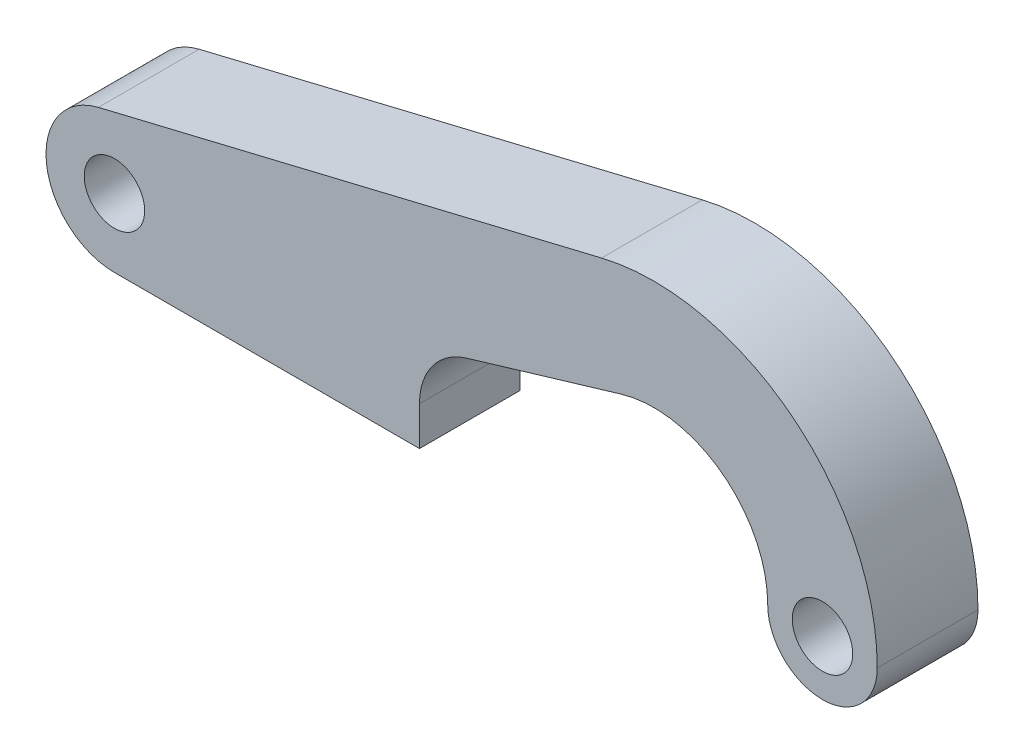
ISO-10303-21;
HEADER;
FILE_DESCRIPTION(('STEP AP214'),'2;1');
FILE_NAME('part.step','',(''),(''),'','','');
FILE_SCHEMA(('AUTOMOTIVE_DESIGN { 1 0 10303 214 1 1 1 1 }'));
ENDSEC;
DATA;
#1=APPLICATION_CONTEXT('core data for automotive mechanical design processes');
#2=APPLICATION_PROTOCOL_DEFINITION('international standard','automotive_design',2000,#1);
#3=PRODUCT_CONTEXT('',#1,'mechanical');
#4=PRODUCT('Part','Part','',(#3));
#5=PRODUCT_RELATED_PRODUCT_CATEGORY('part','',(#4));
#6=PRODUCT_DEFINITION_FORMATION('','',#4);
#7=PRODUCT_DEFINITION_CONTEXT('part definition',#1,'design');
#8=PRODUCT_DEFINITION('design','',#6,#7);
#9=PRODUCT_DEFINITION_SHAPE('','',#8);
#10=(LENGTH_UNIT() NAMED_UNIT(*) SI_UNIT(.MILLI.,.METRE.));
#11=(NAMED_UNIT(*) PLANE_ANGLE_UNIT() SI_UNIT($,.RADIAN.));
#12=(NAMED_UNIT(*) SI_UNIT($,.STERADIAN.) SOLID_ANGLE_UNIT());
#13=UNCERTAINTY_MEASURE_WITH_UNIT(LENGTH_MEASURE(1.E-05),#10,'distance_accuracy_value','');
#14=(GEOMETRIC_REPRESENTATION_CONTEXT(3) GLOBAL_UNCERTAINTY_ASSIGNED_CONTEXT((#13)) GLOBAL_UNIT_ASSIGNED_CONTEXT((#10,
#11,#12)) REPRESENTATION_CONTEXT('',''));
#15=CARTESIAN_POINT('',(0.,0.,0.));
#16=DIRECTION('',(0.,0.,1.));
#17=DIRECTION('',(1.,0.,0.));
#18=AXIS2_PLACEMENT_3D('',#15,#16,#17);
#19=CARTESIAN_POINT('',(31.27375,0.825500000000002,8.636));
#20=DIRECTION('',(0.,0.,-1.));
#21=DIRECTION('',(-1.,0.,0.));
#22=AXIS2_PLACEMENT_3D('',#19,#20,#21);
#23=CYLINDRICAL_SURFACE('',#22,6.604);
#24=DIRECTION('',(0.,0.,1.));
#25=VECTOR('',#24,1.);
#26=CARTESIAN_POINT('',(29.3868928571429,7.15421125288941,2.794));
#27=LINE('',#26,#25);
#28=CARTESIAN_POINT('',(29.3868928571429,7.15421125288941,2.794));
#29=VERTEX_POINT('',#28);
#30=CARTESIAN_POINT('',(29.3868928571429,7.15421125288941,8.636));
#31=VERTEX_POINT('',#30);
#32=EDGE_CURVE('E175',#29,#31,#27,.T.);
#33=ORIENTED_EDGE('',*,*,#32,.F.);
#34=CARTESIAN_POINT('',(31.27375,0.825500000000002,2.794));
#35=DIRECTION('',(0.,0.,-1.));
#36=DIRECTION('',(-1.,0.,0.));
#37=AXIS2_PLACEMENT_3D('',#34,#35,#36);
#38=CIRCLE('',#37,6.604);
#39=CARTESIAN_POINT('',(37.87775,0.825500000000002,2.794));
#40=VERTEX_POINT('',#39);
#41=EDGE_CURVE('E143',#29,#40,#38,.T.);
#42=ORIENTED_EDGE('',*,*,#41,.T.);
#43=DIRECTION('',(0.,0.,-1.));
#44=VECTOR('',#43,1.);
#45=CARTESIAN_POINT('',(37.87775,0.825500000000002,8.636));
#46=LINE('',#45,#44);
#47=CARTESIAN_POINT('',(37.87775,0.825500000000002,8.636));
#48=VERTEX_POINT('',#47);
#49=EDGE_CURVE('E125',#48,#40,#46,.T.);
#50=ORIENTED_EDGE('',*,*,#49,.F.);
#51=CARTESIAN_POINT('',(31.27375,0.825500000000002,8.636));
#52=DIRECTION('',(0.,0.,-1.));
#53=DIRECTION('',(-1.,0.,0.));
#54=AXIS2_PLACEMENT_3D('',#51,#52,#53);
#55=CIRCLE('',#54,6.604);
#56=EDGE_CURVE('E113',#31,#48,#55,.T.);
#57=ORIENTED_EDGE('',*,*,#56,.F.);
#58=EDGE_LOOP('',(#33,#42,#50,#57));
#59=FACE_BOUND('',#58,.T.);
#60=ADVANCED_FACE('F38',(#59),#23,.F.);
#61=CARTESIAN_POINT('',(0.,2.54,8.636));
#62=DIRECTION('',(0.,0.,1.));
#63=DIRECTION('',(1.,0.,0.));
#64=AXIS2_PLACEMENT_3D('',#61,#62,#63);
#65=PLANE('',#64);
#66=DIRECTION('',(0.,-1.,0.));
#67=VECTOR('',#66,1.);
#68=CARTESIAN_POINT('',(17.68475,0.825500000000002,8.636));
#69=LINE('',#68,#67);
#70=CARTESIAN_POINT('',(17.68475,0.825500000000002,8.636));
#71=VERTEX_POINT('',#70);
#72=CARTESIAN_POINT('',(17.68475,-1.42875,8.636));
#73=VERTEX_POINT('',#72);
#74=EDGE_CURVE('E188',#71,#73,#69,.T.);
#75=ORIENTED_EDGE('',*,*,#74,.F.);
#76=CARTESIAN_POINT('',(21.49475,0.825500000000005,8.636));
#77=DIRECTION('',(0.,0.,1.));
#78=DIRECTION('',(1.,0.,0.));
#79=AXIS2_PLACEMENT_3D('',#76,#77,#78);
#80=CIRCLE('',#79,3.81000000000001);
#81=CARTESIAN_POINT('',(20.4061785714286,4.47667956897467,8.636));
#82=VERTEX_POINT('',#81);
#83=EDGE_CURVE('E185',#82,#71,#80,.T.);
#84=ORIENTED_EDGE('',*,*,#83,.F.);
#85=DIRECTION('',(-0.95831484749991,-0.285714285714284,0.));
#86=VECTOR('',#85,1.);
#87=CARTESIAN_POINT('',(20.4061785714286,4.47667956897467,8.636));
#88=LINE('',#87,#86);
#89=EDGE_CURVE('E182',#31,#82,#88,.T.);
#90=ORIENTED_EDGE('',*,*,#89,.F.);
#91=ORIENTED_EDGE('',*,*,#56,.T.);
#92=CARTESIAN_POINT('',(41.05275,0.825500000000002,8.636));
#93=DIRECTION('',(0.,0.,1.));
#94=DIRECTION('',(1.,0.,0.));
#95=AXIS2_PLACEMENT_3D('',#92,#93,#94);
#96=CIRCLE('',#95,3.175);
#97=CARTESIAN_POINT('',(44.22775,0.825500000000003,8.636));
#98=VERTEX_POINT('',#97);
#99=EDGE_CURVE('E103',#48,#98,#96,.T.);
#100=ORIENTED_EDGE('',*,*,#99,.T.);
#101=CARTESIAN_POINT('',(31.27375,0.825500000000002,8.636));
#102=DIRECTION('',(0.,0.,1.));
#103=DIRECTION('',(-1.,0.,0.));
#104=AXIS2_PLACEMENT_3D('',#101,#102,#103);
#105=CIRCLE('',#104,12.954);
#106=CARTESIAN_POINT('',(28.2423910736062,13.4198232870755,8.636));
#107=VERTEX_POINT('',#106);
#108=EDGE_CURVE('E109',#98,#107,#105,.T.);
#109=ORIENTED_EDGE('',*,*,#108,.T.);
#110=DIRECTION('',(-0.972234312727768,-0.234009489454518,0.));
#111=VECTOR('',#110,1.);
#112=CARTESIAN_POINT('',(-0.92872516127262,6.39855492863833,8.636));
#113=LINE('',#112,#111);
#114=CARTESIAN_POINT('',(-0.92872516127262,6.39855492863833,8.636));
#115=VERTEX_POINT('',#114);
#116=EDGE_CURVE('E64',#107,#115,#113,.T.);
#117=ORIENTED_EDGE('',*,*,#116,.T.);
#118=CARTESIAN_POINT('',(0.,2.54,8.636));
#119=DIRECTION('',(0.,0.,1.));
#120=DIRECTION('',(1.,0.,0.));
#121=AXIS2_PLACEMENT_3D('',#118,#119,#120);
#122=CIRCLE('',#121,3.96875);
#123=CARTESIAN_POINT('',(0.,-1.42875,8.636));
#124=VERTEX_POINT('',#123);
#125=EDGE_CURVE('E152',#115,#124,#122,.T.);
#126=ORIENTED_EDGE('',*,*,#125,.T.);
#127=DIRECTION('',(1.,0.,0.));
#128=VECTOR('',#127,1.);
#129=CARTESIAN_POINT('',(0.,-1.42875,8.636));
#130=LINE('',#129,#128);
#131=EDGE_CURVE('E96',#124,#73,#130,.T.);
#132=ORIENTED_EDGE('',*,*,#131,.T.);
#133=EDGE_LOOP('',(#75,#84,#90,#91,#100,#109,#117,#126,#132));
#134=FACE_BOUND('',#133,.T.);
#135=CARTESIAN_POINT('',(41.05275,0.825500000000002,8.636));
#136=DIRECTION('',(0.,0.,1.));
#137=DIRECTION('',(1.,0.,0.));
#138=AXIS2_PLACEMENT_3D('',#135,#136,#137);
#139=CIRCLE('',#138,1.7526);
#140=CARTESIAN_POINT('',(42.80535,0.825500000000002,8.636));
#141=VERTEX_POINT('',#140);
#142=EDGE_CURVE('E140',#141,#141,#139,.T.);
#143=ORIENTED_EDGE('',*,*,#142,.F.);
#144=EDGE_LOOP('',(#143));
#145=FACE_BOUND('',#144,.T.);
#146=CARTESIAN_POINT('',(0.,2.54,8.636));
#147=DIRECTION('',(0.,0.,1.));
#148=DIRECTION('',(1.,0.,0.));
#149=AXIS2_PLACEMENT_3D('',#146,#147,#148);
#150=CIRCLE('',#149,1.7526);
#151=CARTESIAN_POINT('',(1.7526,2.54,8.636));
#152=VERTEX_POINT('',#151);
#153=EDGE_CURVE('E196',#152,#152,#150,.T.);
#154=ORIENTED_EDGE('',*,*,#153,.F.);
#155=EDGE_LOOP('',(#154));
#156=FACE_BOUND('',#155,.T.);
#157=ADVANCED_FACE('F106',(#134,#145,#156),#65,.T.);
#158=CARTESIAN_POINT('',(0.,2.54,2.794));
#159=DIRECTION('',(0.,0.,1.));
#160=DIRECTION('',(1.,0.,0.));
#161=AXIS2_PLACEMENT_3D('',#158,#159,#160);
#162=PLANE('',#161);
#163=CARTESIAN_POINT('',(21.49475,0.825500000000005,2.794));
#164=DIRECTION('',(0.,0.,1.));
#165=DIRECTION('',(1.,0.,0.));
#166=AXIS2_PLACEMENT_3D('',#163,#164,#165);
#167=CIRCLE('',#166,3.81000000000001);
#168=CARTESIAN_POINT('',(20.4061785714286,4.47667956897467,2.794));
#169=VERTEX_POINT('',#168);
#170=CARTESIAN_POINT('',(17.68475,0.825500000000002,2.794));
#171=VERTEX_POINT('',#170);
#172=EDGE_CURVE('E170',#169,#171,#167,.T.);
#173=ORIENTED_EDGE('',*,*,#172,.T.);
#174=DIRECTION('',(0.,-1.,0.));
#175=VECTOR('',#174,1.);
#176=CARTESIAN_POINT('',(17.68475,0.825500000000002,2.794));
#177=LINE('',#176,#175);
#178=CARTESIAN_POINT('',(17.68475,-1.42875,2.794));
#179=VERTEX_POINT('',#178);
#180=EDGE_CURVE('E167',#171,#179,#177,.T.);
#181=ORIENTED_EDGE('',*,*,#180,.T.);
#182=DIRECTION('',(1.,0.,0.));
#183=VECTOR('',#182,1.);
#184=CARTESIAN_POINT('',(0.,-1.42875,2.794));
#185=LINE('',#184,#183);
#186=CARTESIAN_POINT('',(0.,-1.42875,2.794));
#187=VERTEX_POINT('',#186);
#188=EDGE_CURVE('E139',#187,#179,#185,.T.);
#189=ORIENTED_EDGE('',*,*,#188,.F.);
#190=CARTESIAN_POINT('',(0.,2.54,2.794));
#191=DIRECTION('',(0.,0.,1.));
#192=DIRECTION('',(1.,0.,0.));
#193=AXIS2_PLACEMENT_3D('',#190,#191,#192);
#194=CIRCLE('',#193,3.96875);
#195=CARTESIAN_POINT('',(-0.92872516127262,6.39855492863833,2.794));
#196=VERTEX_POINT('',#195);
#197=EDGE_CURVE('E136',#196,#187,#194,.T.);
#198=ORIENTED_EDGE('',*,*,#197,.F.);
#199=DIRECTION('',(-0.972234312727768,-0.234009489454518,0.));
#200=VECTOR('',#199,1.);
#201=CARTESIAN_POINT('',(-0.92872516127262,6.39855492863833,2.794));
#202=LINE('',#201,#200);
#203=CARTESIAN_POINT('',(28.2423910736062,13.4198232870755,2.794));
#204=VERTEX_POINT('',#203);
#205=EDGE_CURVE('E88',#204,#196,#202,.T.);
#206=ORIENTED_EDGE('',*,*,#205,.F.);
#207=CARTESIAN_POINT('',(31.27375,0.825500000000002,2.794));
#208=DIRECTION('',(0.,0.,1.));
#209=DIRECTION('',(-1.,0.,0.));
#210=AXIS2_PLACEMENT_3D('',#207,#208,#209);
#211=CIRCLE('',#210,12.954);
#212=CARTESIAN_POINT('',(44.22775,0.825500000000003,2.794));
#213=VERTEX_POINT('',#212);
#214=EDGE_CURVE('E147',#213,#204,#211,.T.);
#215=ORIENTED_EDGE('',*,*,#214,.F.);
#216=CARTESIAN_POINT('',(41.05275,0.825500000000002,2.794));
#217=DIRECTION('',(0.,0.,1.));
#218=DIRECTION('',(1.,0.,0.));
#219=AXIS2_PLACEMENT_3D('',#216,#217,#218);
#220=CIRCLE('',#219,3.175);
#221=EDGE_CURVE('E122',#40,#213,#220,.T.);
#222=ORIENTED_EDGE('',*,*,#221,.F.);
#223=ORIENTED_EDGE('',*,*,#41,.F.);
#224=DIRECTION('',(-0.95831484749991,-0.285714285714284,0.));
#225=VECTOR('',#224,1.);
#226=CARTESIAN_POINT('',(20.4061785714286,4.47667956897467,2.794));
#227=LINE('',#226,#225);
#228=EDGE_CURVE('E55',#29,#169,#227,.T.);
#229=ORIENTED_EDGE('',*,*,#228,.T.);
#230=EDGE_LOOP('',(#173,#181,#189,#198,#206,#215,#222,#223,#229));
#231=FACE_BOUND('',#230,.T.);
#232=CARTESIAN_POINT('',(41.05275,0.825500000000002,2.794));
#233=DIRECTION('',(0.,0.,1.));
#234=DIRECTION('',(1.,0.,0.));
#235=AXIS2_PLACEMENT_3D('',#232,#233,#234);
#236=CIRCLE('',#235,1.7526);
#237=CARTESIAN_POINT('',(42.80535,0.825500000000002,2.794));
#238=VERTEX_POINT('',#237);
#239=EDGE_CURVE('E199',#238,#238,#236,.T.);
#240=ORIENTED_EDGE('',*,*,#239,.T.);
#241=EDGE_LOOP('',(#240));
#242=FACE_BOUND('',#241,.T.);
#243=CARTESIAN_POINT('',(0.,2.54,2.794));
#244=DIRECTION('',(0.,0.,1.));
#245=DIRECTION('',(1.,0.,0.));
#246=AXIS2_PLACEMENT_3D('',#243,#244,#245);
#247=CIRCLE('',#246,1.7526);
#248=CARTESIAN_POINT('',(1.7526,2.54,2.794));
#249=VERTEX_POINT('',#248);
#250=EDGE_CURVE('E193',#249,#249,#247,.T.);
#251=ORIENTED_EDGE('',*,*,#250,.T.);
#252=EDGE_LOOP('',(#251));
#253=FACE_BOUND('',#252,.T.);
#254=ADVANCED_FACE('F163',(#231,#242,#253),#162,.F.);
#255=CARTESIAN_POINT('',(0.,2.54,8.636));
#256=DIRECTION('',(0.,0.,-1.));
#257=DIRECTION('',(-1.,0.,0.));
#258=AXIS2_PLACEMENT_3D('',#255,#256,#257);
#259=CYLINDRICAL_SURFACE('',#258,3.96875);
#260=ORIENTED_EDGE('',*,*,#197,.T.);
#261=DIRECTION('',(0.,0.,-1.));
#262=VECTOR('',#261,1.);
#263=CARTESIAN_POINT('',(0.,-1.42875,8.636));
#264=LINE('',#263,#262);
#265=EDGE_CURVE('E46',#124,#187,#264,.T.);
#266=ORIENTED_EDGE('',*,*,#265,.F.);
#267=ORIENTED_EDGE('',*,*,#125,.F.);
#268=DIRECTION('',(0.,0.,-1.));
#269=VECTOR('',#268,1.);
#270=CARTESIAN_POINT('',(-0.92872516127262,6.39855492863833,8.636));
#271=LINE('',#270,#269);
#272=EDGE_CURVE('E132',#115,#196,#271,.T.);
#273=ORIENTED_EDGE('',*,*,#272,.T.);
#274=EDGE_LOOP('',(#260,#266,#267,#273));
#275=FACE_BOUND('',#274,.T.);
#276=ADVANCED_FACE('F40',(#275),#259,.T.);
#277=CARTESIAN_POINT('',(0.,-1.42875,8.636));
#278=DIRECTION('',(0.,1.,0.));
#279=DIRECTION('',(0.,0.,1.));
#280=AXIS2_PLACEMENT_3D('',#277,#278,#279);
#281=PLANE('',#280);
#282=ORIENTED_EDGE('',*,*,#188,.T.);
#283=DIRECTION('',(0.,0.,1.));
#284=VECTOR('',#283,1.);
#285=CARTESIAN_POINT('',(17.68475,-1.42875,8.636));
#286=LINE('',#285,#284);
#287=EDGE_CURVE('E11',#179,#73,#286,.T.);
#288=ORIENTED_EDGE('',*,*,#287,.T.);
#289=ORIENTED_EDGE('',*,*,#131,.F.);
#290=ORIENTED_EDGE('',*,*,#265,.T.);
#291=EDGE_LOOP('',(#282,#288,#289,#290));
#292=FACE_BOUND('',#291,.T.);
#293=ADVANCED_FACE('F157',(#292),#281,.F.);
#294=CARTESIAN_POINT('',(41.05275,0.825500000000002,8.636));
#295=DIRECTION('',(0.,0.,-1.));
#296=DIRECTION('',(-1.,0.,0.));
#297=AXIS2_PLACEMENT_3D('',#294,#295,#296);
#298=CYLINDRICAL_SURFACE('',#297,3.175);
#299=ORIENTED_EDGE('',*,*,#221,.T.);
#300=DIRECTION('',(0.,0.,-1.));
#301=VECTOR('',#300,1.);
#302=CARTESIAN_POINT('',(44.22775,0.825500000000003,8.636));
#303=LINE('',#302,#301);
#304=EDGE_CURVE('E119',#98,#213,#303,.T.);
#305=ORIENTED_EDGE('',*,*,#304,.F.);
#306=ORIENTED_EDGE('',*,*,#99,.F.);
#307=ORIENTED_EDGE('',*,*,#49,.T.);
#308=EDGE_LOOP('',(#299,#305,#306,#307));
#309=FACE_BOUND('',#308,.T.);
#310=ADVANCED_FACE('F120',(#309),#298,.T.);
#311=CARTESIAN_POINT('',(31.27375,0.825500000000002,8.636));
#312=DIRECTION('',(0.,0.,-1.));
#313=DIRECTION('',(-1.,0.,0.));
#314=AXIS2_PLACEMENT_3D('',#311,#312,#313);
#315=CYLINDRICAL_SURFACE('',#314,12.954);
#316=ORIENTED_EDGE('',*,*,#214,.T.);
#317=DIRECTION('',(0.,0.,-1.));
#318=VECTOR('',#317,1.);
#319=CARTESIAN_POINT('',(28.2423910736062,13.4198232870755,8.636));
#320=LINE('',#319,#318);
#321=EDGE_CURVE('E126',#107,#204,#320,.T.);
#322=ORIENTED_EDGE('',*,*,#321,.F.);
#323=ORIENTED_EDGE('',*,*,#108,.F.);
#324=ORIENTED_EDGE('',*,*,#304,.T.);
#325=EDGE_LOOP('',(#316,#322,#323,#324));
#326=FACE_BOUND('',#325,.T.);
#327=ADVANCED_FACE('F128',(#326),#315,.T.);
#328=CARTESIAN_POINT('',(-0.92872516127262,6.39855492863833,8.636));
#329=DIRECTION('',(0.234009489454518,-0.972234312727768,0.));
#330=DIRECTION('',(0.972234312727768,0.234009489454518,0.));
#331=AXIS2_PLACEMENT_3D('',#328,#329,#330);
#332=PLANE('',#331);
#333=ORIENTED_EDGE('',*,*,#205,.T.);
#334=ORIENTED_EDGE('',*,*,#272,.F.);
#335=ORIENTED_EDGE('',*,*,#116,.F.);
#336=ORIENTED_EDGE('',*,*,#321,.T.);
#337=EDGE_LOOP('',(#333,#334,#335,#336));
#338=FACE_BOUND('',#337,.T.);
#339=ADVANCED_FACE('F245',(#338),#332,.F.);
#340=CARTESIAN_POINT('',(41.05275,0.825500000000002,8.636));
#341=DIRECTION('',(0.,0.,-1.));
#342=DIRECTION('',(-1.,0.,0.));
#343=AXIS2_PLACEMENT_3D('',#340,#341,#342);
#344=CYLINDRICAL_SURFACE('',#343,1.7526);
#345=ORIENTED_EDGE('',*,*,#142,.T.);
#346=EDGE_LOOP('',(#345));
#347=FACE_BOUND('',#346,.T.);
#348=ORIENTED_EDGE('',*,*,#239,.F.);
#349=EDGE_LOOP('',(#348));
#350=FACE_BOUND('',#349,.T.);
#351=ADVANCED_FACE('F247',(#347,#350),#344,.F.);
#352=CARTESIAN_POINT('',(0.,2.54,8.636));
#353=DIRECTION('',(0.,0.,-1.));
#354=DIRECTION('',(-1.,0.,0.));
#355=AXIS2_PLACEMENT_3D('',#352,#353,#354);
#356=CYLINDRICAL_SURFACE('',#355,1.7526);
#357=ORIENTED_EDGE('',*,*,#153,.T.);
#358=EDGE_LOOP('',(#357));
#359=FACE_BOUND('',#358,.T.);
#360=ORIENTED_EDGE('',*,*,#250,.F.);
#361=EDGE_LOOP('',(#360));
#362=FACE_BOUND('',#361,.T.);
#363=ADVANCED_FACE('F263',(#359,#362),#356,.F.);
#364=CARTESIAN_POINT('',(17.68475,0.825500000000002,2.794));
#365=DIRECTION('',(-1.,0.,0.));
#366=DIRECTION('',(0.,-1.,0.));
#367=AXIS2_PLACEMENT_3D('',#364,#365,#366);
#368=PLANE('',#367);
#369=ORIENTED_EDGE('',*,*,#180,.F.);
#370=DIRECTION('',(0.,0.,1.));
#371=VECTOR('',#370,1.);
#372=CARTESIAN_POINT('',(17.68475,0.825500000000002,2.794));
#373=LINE('',#372,#371);
#374=EDGE_CURVE('E191',#171,#71,#373,.T.);
#375=ORIENTED_EDGE('',*,*,#374,.T.);
#376=ORIENTED_EDGE('',*,*,#74,.T.);
#377=ORIENTED_EDGE('',*,*,#287,.F.);
#378=EDGE_LOOP('',(#369,#375,#376,#377));
#379=FACE_BOUND('',#378,.T.);
#380=ADVANCED_FACE('F270',(#379),#368,.F.);
#381=CARTESIAN_POINT('',(21.49475,0.825500000000005,2.794));
#382=DIRECTION('',(0.,0.,1.));
#383=DIRECTION('',(1.,0.,0.));
#384=AXIS2_PLACEMENT_3D('',#381,#382,#383);
#385=CYLINDRICAL_SURFACE('',#384,3.81000000000001);
#386=ORIENTED_EDGE('',*,*,#83,.T.);
#387=ORIENTED_EDGE('',*,*,#374,.F.);
#388=ORIENTED_EDGE('',*,*,#172,.F.);
#389=DIRECTION('',(0.,0.,1.));
#390=VECTOR('',#389,1.);
#391=CARTESIAN_POINT('',(20.4061785714286,4.47667956897467,2.794));
#392=LINE('',#391,#390);
#393=EDGE_CURVE('E177',#169,#82,#392,.T.);
#394=ORIENTED_EDGE('',*,*,#393,.T.);
#395=EDGE_LOOP('',(#386,#387,#388,#394));
#396=FACE_BOUND('',#395,.T.);
#397=ADVANCED_FACE('F220',(#396),#385,.F.);
#398=CARTESIAN_POINT('',(20.4061785714286,4.47667956897467,2.794));
#399=DIRECTION('',(-0.285714285714284,0.95831484749991,0.));
#400=DIRECTION('',(-0.95831484749991,-0.285714285714284,0.));
#401=AXIS2_PLACEMENT_3D('',#398,#399,#400);
#402=PLANE('',#401);
#403=ORIENTED_EDGE('',*,*,#89,.T.);
#404=ORIENTED_EDGE('',*,*,#393,.F.);
#405=ORIENTED_EDGE('',*,*,#228,.F.);
#406=ORIENTED_EDGE('',*,*,#32,.T.);
#407=EDGE_LOOP('',(#403,#404,#405,#406));
#408=FACE_BOUND('',#407,.T.);
#409=ADVANCED_FACE('F218',(#408),#402,.F.);
#410=CLOSED_SHELL('',(#60,#157,#254,#276,#293,#310,#327,#339,#351,#363,#380,#397,#409));
#411=MANIFOLD_SOLID_BREP('B2',#410);
#412=ADVANCED_BREP_SHAPE_REPRESENTATION('',(#18,#411),#14);
#413=SHAPE_DEFINITION_REPRESENTATION(#9,#412);
ENDSEC;
END-ISO-10303-21;
